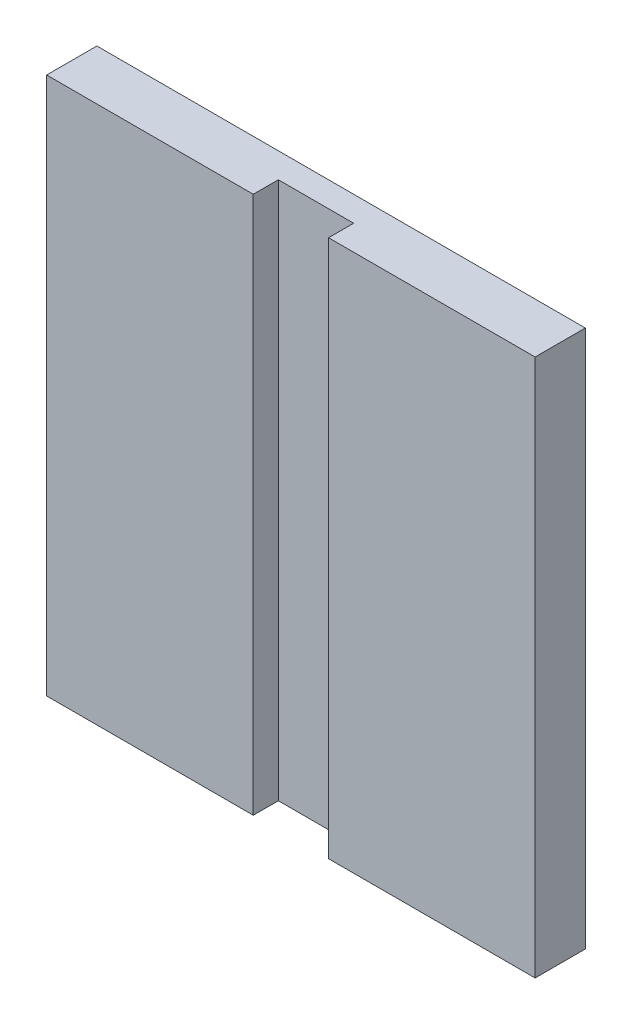
ISO-10303-21;
HEADER;
FILE_DESCRIPTION(('STEP AP214'),'2;1');
FILE_NAME('part.step','',(''),(''),'','','');
FILE_SCHEMA(('AUTOMOTIVE_DESIGN { 1 0 10303 214 1 1 1 1 }'));
ENDSEC;
DATA;
#1=APPLICATION_CONTEXT('core data for automotive mechanical design processes');
#2=APPLICATION_PROTOCOL_DEFINITION('international standard','automotive_design',2000,#1);
#3=PRODUCT_CONTEXT('',#1,'mechanical');
#4=PRODUCT('Part','Part','',(#3));
#5=PRODUCT_RELATED_PRODUCT_CATEGORY('part','',(#4));
#6=PRODUCT_DEFINITION_FORMATION('','',#4);
#7=PRODUCT_DEFINITION_CONTEXT('part definition',#1,'design');
#8=PRODUCT_DEFINITION('design','',#6,#7);
#9=PRODUCT_DEFINITION_SHAPE('','',#8);
#10=(LENGTH_UNIT() NAMED_UNIT(*) SI_UNIT(.MILLI.,.METRE.));
#11=(NAMED_UNIT(*) PLANE_ANGLE_UNIT() SI_UNIT($,.RADIAN.));
#12=(NAMED_UNIT(*) SI_UNIT($,.STERADIAN.) SOLID_ANGLE_UNIT());
#13=UNCERTAINTY_MEASURE_WITH_UNIT(LENGTH_MEASURE(1.E-05),#10,'distance_accuracy_value','');
#14=(GEOMETRIC_REPRESENTATION_CONTEXT(3) GLOBAL_UNCERTAINTY_ASSIGNED_CONTEXT((#13)) GLOBAL_UNIT_ASSIGNED_CONTEXT((#10,
#11,#12)) REPRESENTATION_CONTEXT('',''));
#15=CARTESIAN_POINT('',(0.,0.,0.));
#16=DIRECTION('',(0.,0.,1.));
#17=DIRECTION('',(1.,0.,0.));
#18=AXIS2_PLACEMENT_3D('',#15,#16,#17);
#19=CARTESIAN_POINT('',(0.,0.,10.));
#20=DIRECTION('',(0.,0.,-1.));
#21=DIRECTION('',(-1.,0.,0.));
#22=AXIS2_PLACEMENT_3D('',#19,#20,#21);
#23=PLANE('',#22);
#24=DIRECTION('',(1.,0.,0.));
#25=VECTOR('',#24,1.);
#26=CARTESIAN_POINT('',(-50.2434216460685,-60.4476284843969,10.));
#27=LINE('',#26,#25);
#28=CARTESIAN_POINT('',(-50.2434216460685,-60.4476284843969,10.));
#29=VERTEX_POINT('',#28);
#30=CARTESIAN_POINT('',(-9.09460075552217,-60.4476284843969,10.));
#31=VERTEX_POINT('',#30);
#32=EDGE_CURVE('E142',#29,#31,#27,.T.);
#33=ORIENTED_EDGE('',*,*,#32,.T.);
#34=DIRECTION('',(0.,-1.,0.));
#35=VECTOR('',#34,1.);
#36=CARTESIAN_POINT('',(-9.09460075552218,46.6803669489776,10.));
#37=LINE('',#36,#35);
#38=CARTESIAN_POINT('',(-9.09460075552218,46.6803669489776,10.));
#39=VERTEX_POINT('',#38);
#40=EDGE_CURVE('E113',#39,#31,#37,.T.);
#41=ORIENTED_EDGE('',*,*,#40,.F.);
#42=DIRECTION('',(1.,0.,0.));
#43=VECTOR('',#42,1.);
#44=CARTESIAN_POINT('',(-50.2434216460685,46.6803669489776,10.));
#45=LINE('',#44,#43);
#46=CARTESIAN_POINT('',(-50.2434216460685,46.6803669489776,10.));
#47=VERTEX_POINT('',#46);
#48=EDGE_CURVE('E148',#47,#39,#45,.T.);
#49=ORIENTED_EDGE('',*,*,#48,.F.);
#50=DIRECTION('',(0.,-1.,0.));
#51=VECTOR('',#50,1.);
#52=CARTESIAN_POINT('',(-50.2434216460685,46.6803669489776,10.));
#53=LINE('',#52,#51);
#54=EDGE_CURVE('E57',#47,#29,#53,.T.);
#55=ORIENTED_EDGE('',*,*,#54,.T.);
#56=EDGE_LOOP('',(#33,#41,#49,#55));
#57=FACE_BOUND('',#56,.T.);
#58=ADVANCED_FACE('F33',(#57),#23,.F.);
#59=CARTESIAN_POINT('',(-50.2434216460685,-60.4476284843969,10.));
#60=DIRECTION('',(0.,1.,0.));
#61=DIRECTION('',(0.,0.,1.));
#62=AXIS2_PLACEMENT_3D('',#59,#60,#61);
#63=PLANE('',#62);
#64=DIRECTION('',(1.,0.,0.));
#65=VECTOR('',#64,1.);
#66=CARTESIAN_POINT('',(-9.09460075552217,-60.4476284843969,5.));
#67=LINE('',#66,#65);
#68=CARTESIAN_POINT('',(-9.09460075552217,-60.4476284843969,5.));
#69=VERTEX_POINT('',#68);
#70=CARTESIAN_POINT('',(5.90539924447785,-60.4476284843969,5.));
#71=VERTEX_POINT('',#70);
#72=EDGE_CURVE('E123',#69,#71,#67,.T.);
#73=ORIENTED_EDGE('',*,*,#72,.F.);
#74=DIRECTION('',(0.,0.,1.));
#75=VECTOR('',#74,1.);
#76=CARTESIAN_POINT('',(-9.09460075552217,-60.4476284843969,5.));
#77=LINE('',#76,#75);
#78=EDGE_CURVE('E107',#69,#31,#77,.T.);
#79=ORIENTED_EDGE('',*,*,#78,.T.);
#80=ORIENTED_EDGE('',*,*,#32,.F.);
#81=DIRECTION('',(0.,0.,-1.));
#82=VECTOR('',#81,1.);
#83=CARTESIAN_POINT('',(-50.2434216460685,-60.4476284843969,10.));
#84=LINE('',#83,#82);
#85=CARTESIAN_POINT('',(-50.2434216460685,-60.4476284843969,0.));
#86=VERTEX_POINT('',#85);
#87=EDGE_CURVE('E152',#29,#86,#84,.T.);
#88=ORIENTED_EDGE('',*,*,#87,.T.);
#89=DIRECTION('',(1.,0.,0.));
#90=VECTOR('',#89,1.);
#91=CARTESIAN_POINT('',(-50.2434216460685,-60.4476284843969,0.));
#92=LINE('',#91,#90);
#93=CARTESIAN_POINT('',(47.0542201350242,-60.4476284843969,0.));
#94=VERTEX_POINT('',#93);
#95=EDGE_CURVE('E137',#86,#94,#92,.T.);
#96=ORIENTED_EDGE('',*,*,#95,.T.);
#97=DIRECTION('',(0.,0.,-1.));
#98=VECTOR('',#97,1.);
#99=CARTESIAN_POINT('',(47.0542201350242,-60.4476284843969,10.));
#100=LINE('',#99,#98);
#101=CARTESIAN_POINT('',(47.0542201350242,-60.4476284843969,10.));
#102=VERTEX_POINT('',#101);
#103=EDGE_CURVE('E11',#102,#94,#100,.T.);
#104=ORIENTED_EDGE('',*,*,#103,.F.);
#105=CARTESIAN_POINT('',(5.90539924447785,-60.4476284843969,10.));
#106=VERTEX_POINT('',#105);
#107=EDGE_CURVE('E84',#106,#102,#27,.T.);
#108=ORIENTED_EDGE('',*,*,#107,.F.);
#109=DIRECTION('',(0.,0.,1.));
#110=VECTOR('',#109,1.);
#111=CARTESIAN_POINT('',(5.90539924447785,-60.4476284843969,5.));
#112=LINE('',#111,#110);
#113=EDGE_CURVE('E48',#71,#106,#112,.T.);
#114=ORIENTED_EDGE('',*,*,#113,.F.);
#115=EDGE_LOOP('',(#73,#79,#80,#88,#96,#104,#108,#114));
#116=FACE_BOUND('',#115,.T.);
#117=ADVANCED_FACE('F35',(#116),#63,.F.);
#118=CARTESIAN_POINT('',(47.0542201350241,46.6803669489776,10.));
#119=DIRECTION('',(1.,0.,0.));
#120=DIRECTION('',(0.,1.,0.));
#121=AXIS2_PLACEMENT_3D('',#118,#119,#120);
#122=PLANE('',#121);
#123=DIRECTION('',(0.,-1.,0.));
#124=VECTOR('',#123,1.);
#125=CARTESIAN_POINT('',(47.0542201350241,46.6803669489776,0.));
#126=LINE('',#125,#124);
#127=CARTESIAN_POINT('',(47.0542201350241,46.6803669489776,0.));
#128=VERTEX_POINT('',#127);
#129=EDGE_CURVE('E155',#128,#94,#126,.T.);
#130=ORIENTED_EDGE('',*,*,#129,.F.);
#131=DIRECTION('',(0.,0.,-1.));
#132=VECTOR('',#131,1.);
#133=CARTESIAN_POINT('',(47.0542201350241,46.6803669489776,10.));
#134=LINE('',#133,#132);
#135=CARTESIAN_POINT('',(47.0542201350241,46.6803669489776,10.));
#136=VERTEX_POINT('',#135);
#137=EDGE_CURVE('E41',#136,#128,#134,.T.);
#138=ORIENTED_EDGE('',*,*,#137,.F.);
#139=DIRECTION('',(0.,-1.,0.));
#140=VECTOR('',#139,1.);
#141=CARTESIAN_POINT('',(47.0542201350241,46.6803669489776,10.));
#142=LINE('',#141,#140);
#143=EDGE_CURVE('E144',#136,#102,#142,.T.);
#144=ORIENTED_EDGE('',*,*,#143,.T.);
#145=ORIENTED_EDGE('',*,*,#103,.T.);
#146=EDGE_LOOP('',(#130,#138,#144,#145));
#147=FACE_BOUND('',#146,.T.);
#148=ADVANCED_FACE('F171',(#147),#122,.T.);
#149=CARTESIAN_POINT('',(-50.2434216460685,46.6803669489776,10.));
#150=DIRECTION('',(0.,1.,0.));
#151=DIRECTION('',(0.,0.,1.));
#152=AXIS2_PLACEMENT_3D('',#149,#150,#151);
#153=PLANE('',#152);
#154=DIRECTION('',(0.,0.,1.));
#155=VECTOR('',#154,1.);
#156=CARTESIAN_POINT('',(-9.09460075552218,46.6803669489776,5.));
#157=LINE('',#156,#155);
#158=CARTESIAN_POINT('',(-9.09460075552218,46.6803669489776,5.));
#159=VERTEX_POINT('',#158);
#160=EDGE_CURVE('E135',#159,#39,#157,.T.);
#161=ORIENTED_EDGE('',*,*,#160,.F.);
#162=DIRECTION('',(-1.,0.,0.));
#163=VECTOR('',#162,1.);
#164=CARTESIAN_POINT('',(-9.09460075552218,46.6803669489776,5.));
#165=LINE('',#164,#163);
#166=CARTESIAN_POINT('',(5.90539924447782,46.6803669489776,5.));
#167=VERTEX_POINT('',#166);
#168=EDGE_CURVE('E117',#167,#159,#165,.T.);
#169=ORIENTED_EDGE('',*,*,#168,.F.);
#170=DIRECTION('',(0.,0.,1.));
#171=VECTOR('',#170,1.);
#172=CARTESIAN_POINT('',(5.90539924447782,46.6803669489776,5.));
#173=LINE('',#172,#171);
#174=CARTESIAN_POINT('',(5.90539924447782,46.6803669489776,10.));
#175=VERTEX_POINT('',#174);
#176=EDGE_CURVE('E138',#167,#175,#173,.T.);
#177=ORIENTED_EDGE('',*,*,#176,.T.);
#178=EDGE_CURVE('E147',#175,#136,#45,.T.);
#179=ORIENTED_EDGE('',*,*,#178,.T.);
#180=ORIENTED_EDGE('',*,*,#137,.T.);
#181=DIRECTION('',(1.,0.,0.));
#182=VECTOR('',#181,1.);
#183=CARTESIAN_POINT('',(-50.2434216460685,46.6803669489776,0.));
#184=LINE('',#183,#182);
#185=CARTESIAN_POINT('',(-50.2434216460685,46.6803669489776,0.));
#186=VERTEX_POINT('',#185);
#187=EDGE_CURVE('E158',#186,#128,#184,.T.);
#188=ORIENTED_EDGE('',*,*,#187,.F.);
#189=DIRECTION('',(0.,0.,-1.));
#190=VECTOR('',#189,1.);
#191=CARTESIAN_POINT('',(-50.2434216460685,46.6803669489776,10.));
#192=LINE('',#191,#190);
#193=EDGE_CURVE('E163',#47,#186,#192,.T.);
#194=ORIENTED_EDGE('',*,*,#193,.F.);
#195=ORIENTED_EDGE('',*,*,#48,.T.);
#196=EDGE_LOOP('',(#161,#169,#177,#179,#180,#188,#194,#195));
#197=FACE_BOUND('',#196,.T.);
#198=ADVANCED_FACE('F168',(#197),#153,.T.);
#199=CARTESIAN_POINT('',(-50.2434216460685,46.6803669489776,10.));
#200=DIRECTION('',(1.,0.,0.));
#201=DIRECTION('',(0.,1.,0.));
#202=AXIS2_PLACEMENT_3D('',#199,#200,#201);
#203=PLANE('',#202);
#204=DIRECTION('',(0.,-1.,0.));
#205=VECTOR('',#204,1.);
#206=CARTESIAN_POINT('',(-50.2434216460685,46.6803669489776,0.));
#207=LINE('',#206,#205);
#208=EDGE_CURVE('E77',#186,#86,#207,.T.);
#209=ORIENTED_EDGE('',*,*,#208,.T.);
#210=ORIENTED_EDGE('',*,*,#87,.F.);
#211=ORIENTED_EDGE('',*,*,#54,.F.);
#212=ORIENTED_EDGE('',*,*,#193,.T.);
#213=EDGE_LOOP('',(#209,#210,#211,#212));
#214=FACE_BOUND('',#213,.T.);
#215=ADVANCED_FACE('F175',(#214),#203,.F.);
#216=ORIENTED_EDGE('',*,*,#178,.F.);
#217=DIRECTION('',(0.,1.,0.));
#218=VECTOR('',#217,1.);
#219=CARTESIAN_POINT('',(5.90539924447782,46.6803669489776,10.));
#220=LINE('',#219,#218);
#221=EDGE_CURVE('E126',#106,#175,#220,.T.);
#222=ORIENTED_EDGE('',*,*,#221,.F.);
#223=ORIENTED_EDGE('',*,*,#107,.T.);
#224=ORIENTED_EDGE('',*,*,#143,.F.);
#225=EDGE_LOOP('',(#216,#222,#223,#224));
#226=FACE_BOUND('',#225,.T.);
#227=ADVANCED_FACE('F176',(#226),#23,.F.);
#228=CARTESIAN_POINT('',(0.,0.,0.));
#229=DIRECTION('',(0.,0.,-1.));
#230=DIRECTION('',(-1.,0.,0.));
#231=AXIS2_PLACEMENT_3D('',#228,#229,#230);
#232=PLANE('',#231);
#233=ORIENTED_EDGE('',*,*,#95,.F.);
#234=ORIENTED_EDGE('',*,*,#208,.F.);
#235=ORIENTED_EDGE('',*,*,#187,.T.);
#236=ORIENTED_EDGE('',*,*,#129,.T.);
#237=EDGE_LOOP('',(#233,#234,#235,#236));
#238=FACE_BOUND('',#237,.T.);
#239=ADVANCED_FACE('F174',(#238),#232,.T.);
#240=CARTESIAN_POINT('',(-9.09460075552218,46.6803669489776,5.));
#241=DIRECTION('',(-1.,0.,0.));
#242=DIRECTION('',(0.,-1.,0.));
#243=AXIS2_PLACEMENT_3D('',#240,#241,#242);
#244=PLANE('',#243);
#245=ORIENTED_EDGE('',*,*,#40,.T.);
#246=ORIENTED_EDGE('',*,*,#78,.F.);
#247=DIRECTION('',(0.,-1.,0.));
#248=VECTOR('',#247,1.);
#249=CARTESIAN_POINT('',(-9.09460075552218,46.6803669489776,5.));
#250=LINE('',#249,#248);
#251=EDGE_CURVE('E110',#159,#69,#250,.T.);
#252=ORIENTED_EDGE('',*,*,#251,.F.);
#253=ORIENTED_EDGE('',*,*,#160,.T.);
#254=EDGE_LOOP('',(#245,#246,#252,#253));
#255=FACE_BOUND('',#254,.T.);
#256=ADVANCED_FACE('F109',(#255),#244,.F.);
#257=CARTESIAN_POINT('',(5.90539924447782,46.6803669489776,5.));
#258=DIRECTION('',(1.,0.,0.));
#259=DIRECTION('',(0.,1.,0.));
#260=AXIS2_PLACEMENT_3D('',#257,#258,#259);
#261=PLANE('',#260);
#262=ORIENTED_EDGE('',*,*,#221,.T.);
#263=ORIENTED_EDGE('',*,*,#176,.F.);
#264=DIRECTION('',(0.,1.,0.));
#265=VECTOR('',#264,1.);
#266=CARTESIAN_POINT('',(5.90539924447782,46.6803669489776,5.));
#267=LINE('',#266,#265);
#268=EDGE_CURVE('E128',#71,#167,#267,.T.);
#269=ORIENTED_EDGE('',*,*,#268,.F.);
#270=ORIENTED_EDGE('',*,*,#113,.T.);
#271=EDGE_LOOP('',(#262,#263,#269,#270));
#272=FACE_BOUND('',#271,.T.);
#273=ADVANCED_FACE('F177',(#272),#261,.F.);
#274=CARTESIAN_POINT('',(0.,0.,5.));
#275=DIRECTION('',(0.,0.,1.));
#276=DIRECTION('',(1.,0.,0.));
#277=AXIS2_PLACEMENT_3D('',#274,#275,#276);
#278=PLANE('',#277);
#279=ORIENTED_EDGE('',*,*,#251,.T.);
#280=ORIENTED_EDGE('',*,*,#72,.T.);
#281=ORIENTED_EDGE('',*,*,#268,.T.);
#282=ORIENTED_EDGE('',*,*,#168,.T.);
#283=EDGE_LOOP('',(#279,#280,#281,#282));
#284=FACE_BOUND('',#283,.T.);
#285=ADVANCED_FACE('F121',(#284),#278,.T.);
#286=CLOSED_SHELL('',(#58,#117,#148,#198,#215,#227,#239,#256,#273,#285));
#287=MANIFOLD_SOLID_BREP('B2',#286);
#288=ADVANCED_BREP_SHAPE_REPRESENTATION('',(#18,#287),#14);
#289=SHAPE_DEFINITION_REPRESENTATION(#9,#288);
ENDSEC;
END-ISO-10303-21;
